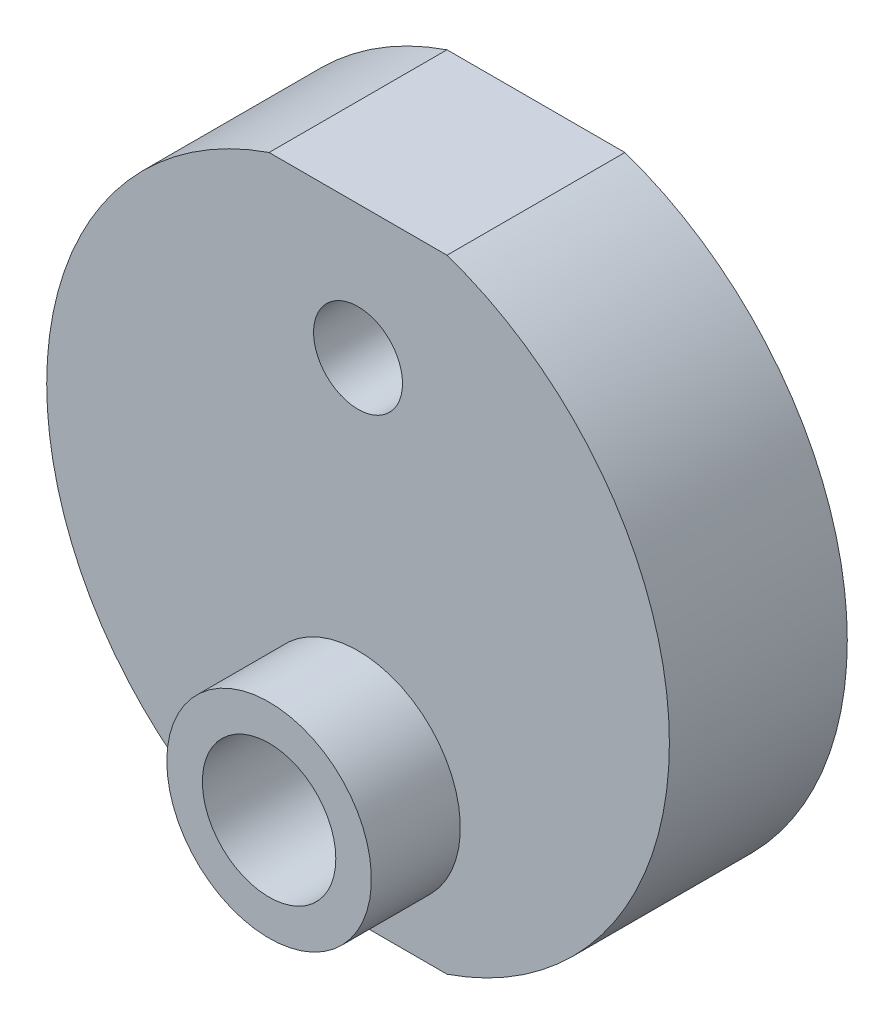
ISO-10303-21;
HEADER;
FILE_DESCRIPTION(('STEP AP214'),'2;1');
FILE_NAME('part.step','',(''),(''),'','','');
FILE_SCHEMA(('AUTOMOTIVE_DESIGN { 1 0 10303 214 1 1 1 1 }'));
ENDSEC;
DATA;
#1=APPLICATION_CONTEXT('core data for automotive mechanical design processes');
#2=APPLICATION_PROTOCOL_DEFINITION('international standard','automotive_design',2000,#1);
#3=PRODUCT_CONTEXT('',#1,'mechanical');
#4=PRODUCT('Part','Part','',(#3));
#5=PRODUCT_RELATED_PRODUCT_CATEGORY('part','',(#4));
#6=PRODUCT_DEFINITION_FORMATION('','',#4);
#7=PRODUCT_DEFINITION_CONTEXT('part definition',#1,'design');
#8=PRODUCT_DEFINITION('design','',#6,#7);
#9=PRODUCT_DEFINITION_SHAPE('','',#8);
#10=(LENGTH_UNIT() NAMED_UNIT(*) SI_UNIT(.MILLI.,.METRE.));
#11=(NAMED_UNIT(*) PLANE_ANGLE_UNIT() SI_UNIT($,.RADIAN.));
#12=(NAMED_UNIT(*) SI_UNIT($,.STERADIAN.) SOLID_ANGLE_UNIT());
#13=UNCERTAINTY_MEASURE_WITH_UNIT(LENGTH_MEASURE(1.E-05),#10,'distance_accuracy_value','');
#14=(GEOMETRIC_REPRESENTATION_CONTEXT(3) GLOBAL_UNCERTAINTY_ASSIGNED_CONTEXT((#13)) GLOBAL_UNIT_ASSIGNED_CONTEXT((#10,
#11,#12)) REPRESENTATION_CONTEXT('',''));
#15=CARTESIAN_POINT('',(0.,0.,0.));
#16=DIRECTION('',(0.,0.,1.));
#17=DIRECTION('',(1.,0.,0.));
#18=AXIS2_PLACEMENT_3D('',#15,#16,#17);
#19=CARTESIAN_POINT('',(0.,0.,12.7));
#20=DIRECTION('',(0.,0.,1.));
#21=DIRECTION('',(1.,0.,0.));
#22=AXIS2_PLACEMENT_3D('',#19,#20,#21);
#23=PLANE('',#22);
#24=DIRECTION('',(-1.,0.,0.));
#25=VECTOR('',#24,1.);
#26=CARTESIAN_POINT('',(0.,256.159,12.7));
#27=LINE('',#26,#25);
#28=CARTESIAN_POINT('',(277.621999996789,256.159,12.7));
#29=VERTEX_POINT('',#28);
#30=CARTESIAN_POINT('',(264.921999996789,256.159,12.7));
#31=VERTEX_POINT('',#30);
#32=EDGE_CURVE('E81',#29,#31,#27,.T.);
#33=ORIENTED_EDGE('',*,*,#32,.T.);
#34=CARTESIAN_POINT('',(272.541999967478,233.934,12.7));
#35=DIRECTION('',(0.,0.,1.));
#36=DIRECTION('',(1.,0.,0.));
#37=AXIS2_PLACEMENT_3D('',#34,#35,#36);
#38=CIRCLE('',#37,23.494999990494);
#39=CARTESIAN_POINT('',(264.921999996789,211.709,12.7));
#40=VERTEX_POINT('',#39);
#41=EDGE_CURVE('E76',#31,#40,#38,.T.);
#42=ORIENTED_EDGE('',*,*,#41,.T.);
#43=DIRECTION('',(-1.,0.,0.));
#44=VECTOR('',#43,1.);
#45=CARTESIAN_POINT('',(0.,211.709,12.7));
#46=LINE('',#45,#44);
#47=CARTESIAN_POINT('',(277.621999996789,211.709,12.7));
#48=VERTEX_POINT('',#47);
#49=EDGE_CURVE('E79',#48,#40,#46,.T.);
#50=ORIENTED_EDGE('',*,*,#49,.F.);
#51=CARTESIAN_POINT('',(270.002000026099,233.934,12.7));
#52=DIRECTION('',(0.,0.,1.));
#53=DIRECTION('',(1.,0.,0.));
#54=AXIS2_PLACEMENT_3D('',#51,#52,#53);
#55=CIRCLE('',#54,23.494999990494);
#56=EDGE_CURVE('E50',#48,#29,#55,.T.);
#57=ORIENTED_EDGE('',*,*,#56,.T.);
#58=EDGE_LOOP('',(#33,#42,#50,#57));
#59=FACE_BOUND('',#58,.T.);
#60=CARTESIAN_POINT('',(271.271999996789,246.634,12.7));
#61=DIRECTION('',(0.,0.,1.));
#62=DIRECTION('',(1.,0.,0.));
#63=AXIS2_PLACEMENT_3D('',#60,#61,#62);
#64=CIRCLE('',#63,3.17499999999998);
#65=CARTESIAN_POINT('',(274.446999996789,246.634,12.7));
#66=VERTEX_POINT('',#65);
#67=EDGE_CURVE('E110',#66,#66,#64,.T.);
#68=ORIENTED_EDGE('',*,*,#67,.F.);
#69=EDGE_LOOP('',(#68));
#70=FACE_BOUND('',#69,.T.);
#71=CARTESIAN_POINT('',(271.271999996789,221.234,12.7));
#72=DIRECTION('',(0.,0.,1.));
#73=DIRECTION('',(1.,0.,0.));
#74=AXIS2_PLACEMENT_3D('',#71,#72,#73);
#75=CIRCLE('',#74,7.30249999999999);
#76=CARTESIAN_POINT('',(263.969499996789,221.234,12.7));
#77=VERTEX_POINT('',#76);
#78=EDGE_CURVE('E100',#77,#77,#75,.F.);
#79=ORIENTED_EDGE('',*,*,#78,.T.);
#80=EDGE_LOOP('',(#79));
#81=FACE_BOUND('',#80,.T.);
#82=ADVANCED_FACE('F33',(#59,#70,#81),#23,.T.);
#83=CARTESIAN_POINT('',(0.,256.159,12.7));
#84=DIRECTION('',(0.,-1.,0.));
#85=DIRECTION('',(0.,0.,-1.));
#86=AXIS2_PLACEMENT_3D('',#83,#84,#85);
#87=PLANE('',#86);
#88=DIRECTION('',(-1.,0.,0.));
#89=VECTOR('',#88,1.);
#90=CARTESIAN_POINT('',(0.,256.159,0.));
#91=LINE('',#90,#89);
#92=CARTESIAN_POINT('',(277.621999996789,256.159,0.));
#93=VERTEX_POINT('',#92);
#94=CARTESIAN_POINT('',(264.921999996789,256.159,0.));
#95=VERTEX_POINT('',#94);
#96=EDGE_CURVE('E99',#93,#95,#91,.T.);
#97=ORIENTED_EDGE('',*,*,#96,.T.);
#98=DIRECTION('',(0.,0.,-1.));
#99=VECTOR('',#98,1.);
#100=CARTESIAN_POINT('',(264.921999996789,256.159,12.7));
#101=LINE('',#100,#99);
#102=EDGE_CURVE('E11',#31,#95,#101,.T.);
#103=ORIENTED_EDGE('',*,*,#102,.F.);
#104=ORIENTED_EDGE('',*,*,#32,.F.);
#105=DIRECTION('',(0.,0.,-1.));
#106=VECTOR('',#105,1.);
#107=CARTESIAN_POINT('',(277.621999996789,256.159,12.7));
#108=LINE('',#107,#106);
#109=EDGE_CURVE('E92',#29,#93,#108,.T.);
#110=ORIENTED_EDGE('',*,*,#109,.T.);
#111=EDGE_LOOP('',(#97,#103,#104,#110));
#112=FACE_BOUND('',#111,.T.);
#113=ADVANCED_FACE('F114',(#112),#87,.F.);
#114=CARTESIAN_POINT('',(272.541999967478,233.934,12.7));
#115=DIRECTION('',(0.,0.,-1.));
#116=DIRECTION('',(-1.,0.,0.));
#117=AXIS2_PLACEMENT_3D('',#114,#115,#116);
#118=CYLINDRICAL_SURFACE('',#117,23.494999990494);
#119=CARTESIAN_POINT('',(272.541999967478,233.934,0.));
#120=DIRECTION('',(0.,0.,1.));
#121=DIRECTION('',(1.,0.,0.));
#122=AXIS2_PLACEMENT_3D('',#119,#120,#121);
#123=CIRCLE('',#122,23.494999990494);
#124=CARTESIAN_POINT('',(264.921999996789,211.709,0.));
#125=VERTEX_POINT('',#124);
#126=EDGE_CURVE('E86',#95,#125,#123,.T.);
#127=ORIENTED_EDGE('',*,*,#126,.T.);
#128=DIRECTION('',(0.,0.,-1.));
#129=VECTOR('',#128,1.);
#130=CARTESIAN_POINT('',(264.921999996789,211.709,12.7));
#131=LINE('',#130,#129);
#132=EDGE_CURVE('E42',#40,#125,#131,.T.);
#133=ORIENTED_EDGE('',*,*,#132,.F.);
#134=ORIENTED_EDGE('',*,*,#41,.F.);
#135=ORIENTED_EDGE('',*,*,#102,.T.);
#136=EDGE_LOOP('',(#127,#133,#134,#135));
#137=FACE_BOUND('',#136,.T.);
#138=ADVANCED_FACE('F85',(#137),#118,.T.);
#139=CARTESIAN_POINT('',(0.,211.709,12.7));
#140=DIRECTION('',(0.,-1.,0.));
#141=DIRECTION('',(0.,0.,-1.));
#142=AXIS2_PLACEMENT_3D('',#139,#140,#141);
#143=PLANE('',#142);
#144=DIRECTION('',(-1.,0.,0.));
#145=VECTOR('',#144,1.);
#146=CARTESIAN_POINT('',(0.,211.709,0.));
#147=LINE('',#146,#145);
#148=CARTESIAN_POINT('',(277.621999996789,211.709,0.));
#149=VERTEX_POINT('',#148);
#150=EDGE_CURVE('E104',#149,#125,#147,.T.);
#151=ORIENTED_EDGE('',*,*,#150,.F.);
#152=DIRECTION('',(0.,0.,-1.));
#153=VECTOR('',#152,1.);
#154=CARTESIAN_POINT('',(277.621999996789,211.709,12.7));
#155=LINE('',#154,#153);
#156=EDGE_CURVE('E66',#48,#149,#155,.T.);
#157=ORIENTED_EDGE('',*,*,#156,.F.);
#158=ORIENTED_EDGE('',*,*,#49,.T.);
#159=ORIENTED_EDGE('',*,*,#132,.T.);
#160=EDGE_LOOP('',(#151,#157,#158,#159));
#161=FACE_BOUND('',#160,.T.);
#162=ADVANCED_FACE('F90',(#161),#143,.T.);
#163=CARTESIAN_POINT('',(270.002000026099,233.934,12.7));
#164=DIRECTION('',(0.,0.,-1.));
#165=DIRECTION('',(-1.,0.,0.));
#166=AXIS2_PLACEMENT_3D('',#163,#164,#165);
#167=CYLINDRICAL_SURFACE('',#166,23.494999990494);
#168=CARTESIAN_POINT('',(270.002000026099,233.934,0.));
#169=DIRECTION('',(0.,0.,1.));
#170=DIRECTION('',(1.,0.,0.));
#171=AXIS2_PLACEMENT_3D('',#168,#169,#170);
#172=CIRCLE('',#171,23.494999990494);
#173=EDGE_CURVE('E69',#149,#93,#172,.T.);
#174=ORIENTED_EDGE('',*,*,#173,.T.);
#175=ORIENTED_EDGE('',*,*,#109,.F.);
#176=ORIENTED_EDGE('',*,*,#56,.F.);
#177=ORIENTED_EDGE('',*,*,#156,.T.);
#178=EDGE_LOOP('',(#174,#175,#176,#177));
#179=FACE_BOUND('',#178,.T.);
#180=ADVANCED_FACE('F126',(#179),#167,.T.);
#181=CARTESIAN_POINT('',(271.271999996789,246.634,12.7));
#182=DIRECTION('',(0.,0.,-1.));
#183=DIRECTION('',(-1.,0.,0.));
#184=AXIS2_PLACEMENT_3D('',#181,#182,#183);
#185=CYLINDRICAL_SURFACE('',#184,3.17499999999998);
#186=ORIENTED_EDGE('',*,*,#67,.T.);
#187=EDGE_LOOP('',(#186));
#188=FACE_BOUND('',#187,.T.);
#189=CARTESIAN_POINT('',(271.271999996789,246.634,0.));
#190=DIRECTION('',(0.,0.,1.));
#191=DIRECTION('',(1.,0.,0.));
#192=AXIS2_PLACEMENT_3D('',#189,#190,#191);
#193=CIRCLE('',#192,3.17499999999998);
#194=CARTESIAN_POINT('',(274.446999996789,246.634,0.));
#195=VERTEX_POINT('',#194);
#196=EDGE_CURVE('E96',#195,#195,#193,.T.);
#197=ORIENTED_EDGE('',*,*,#196,.F.);
#198=EDGE_LOOP('',(#197));
#199=FACE_BOUND('',#198,.T.);
#200=ADVANCED_FACE('F35',(#188,#199),#185,.F.);
#201=CARTESIAN_POINT('',(271.271999996789,221.234,12.7));
#202=DIRECTION('',(0.,0.,-1.));
#203=DIRECTION('',(-1.,0.,0.));
#204=AXIS2_PLACEMENT_3D('',#201,#202,#203);
#205=CYLINDRICAL_SURFACE('',#204,4.76250000000006);
#206=CARTESIAN_POINT('',(271.271999996789,221.234,0.));
#207=DIRECTION('',(0.,0.,1.));
#208=DIRECTION('',(1.,0.,0.));
#209=AXIS2_PLACEMENT_3D('',#206,#207,#208);
#210=CIRCLE('',#209,4.76250000000006);
#211=CARTESIAN_POINT('',(276.034499996789,221.234,0.));
#212=VERTEX_POINT('',#211);
#213=EDGE_CURVE('E107',#212,#212,#210,.T.);
#214=ORIENTED_EDGE('',*,*,#213,.F.);
#215=EDGE_LOOP('',(#214));
#216=FACE_BOUND('',#215,.T.);
#217=CARTESIAN_POINT('',(271.271999996789,221.234,19.05));
#218=DIRECTION('',(0.,0.,1.));
#219=DIRECTION('',(1.,0.,0.));
#220=AXIS2_PLACEMENT_3D('',#217,#218,#219);
#221=CIRCLE('',#220,4.76250000000006);
#222=CARTESIAN_POINT('',(276.034499996789,221.234,19.05));
#223=VERTEX_POINT('',#222);
#224=EDGE_CURVE('E206',#223,#223,#221,.T.);
#225=ORIENTED_EDGE('',*,*,#224,.T.);
#226=EDGE_LOOP('',(#225));
#227=FACE_BOUND('',#226,.T.);
#228=ADVANCED_FACE('F120',(#216,#227),#205,.F.);
#229=CARTESIAN_POINT('',(0.,0.,0.));
#230=DIRECTION('',(0.,0.,1.));
#231=DIRECTION('',(1.,0.,0.));
#232=AXIS2_PLACEMENT_3D('',#229,#230,#231);
#233=PLANE('',#232);
#234=ORIENTED_EDGE('',*,*,#213,.T.);
#235=EDGE_LOOP('',(#234));
#236=FACE_BOUND('',#235,.T.);
#237=ORIENTED_EDGE('',*,*,#96,.F.);
#238=ORIENTED_EDGE('',*,*,#173,.F.);
#239=ORIENTED_EDGE('',*,*,#150,.T.);
#240=ORIENTED_EDGE('',*,*,#126,.F.);
#241=EDGE_LOOP('',(#237,#238,#239,#240));
#242=FACE_BOUND('',#241,.T.);
#243=ORIENTED_EDGE('',*,*,#196,.T.);
#244=EDGE_LOOP('',(#243));
#245=FACE_BOUND('',#244,.T.);
#246=ADVANCED_FACE('F116',(#236,#242,#245),#233,.F.);
#247=CARTESIAN_POINT('',(271.271999996789,221.234,19.05));
#248=DIRECTION('',(0.,0.,-1.));
#249=DIRECTION('',(-1.,0.,0.));
#250=AXIS2_PLACEMENT_3D('',#247,#248,#249);
#251=CYLINDRICAL_SURFACE('',#250,7.30249999999999);
#252=CARTESIAN_POINT('',(271.271999996789,221.234,19.05));
#253=DIRECTION('',(0.,0.,1.));
#254=DIRECTION('',(1.,0.,0.));
#255=AXIS2_PLACEMENT_3D('',#252,#253,#254);
#256=CIRCLE('',#255,7.30249999999999);
#257=CARTESIAN_POINT('',(263.969499996789,221.234,19.05));
#258=VERTEX_POINT('',#257);
#259=EDGE_CURVE('E209',#258,#258,#256,.T.);
#260=CARTESIAN_POINT('',(263.969499996789,221.234,12.7));
#261=CARTESIAN_POINT('',(263.969499996789,221.234,12.7661458333333));
#262=CARTESIAN_POINT('',(263.969499996789,221.234,12.8322916666667));
#263=CARTESIAN_POINT('',(263.969499996789,221.234,12.9645833333333));
#264=CARTESIAN_POINT('',(263.969499996789,221.234,13.0307291666667));
#265=CARTESIAN_POINT('',(263.969499996789,221.234,13.1630208333333));
#266=CARTESIAN_POINT('',(263.969499996789,221.234,13.2291666666667));
#267=CARTESIAN_POINT('',(263.969499996789,221.234,13.3614583333333));
#268=CARTESIAN_POINT('',(263.969499996789,221.234,13.4276041666667));
#269=CARTESIAN_POINT('',(263.969499996789,221.234,13.5598958333333));
#270=CARTESIAN_POINT('',(263.969499996789,221.234,13.6260416666667));
#271=CARTESIAN_POINT('',(263.969499996789,221.234,13.7583333333333));
#272=CARTESIAN_POINT('',(263.969499996789,221.234,13.8244791666667));
#273=CARTESIAN_POINT('',(263.969499996789,221.234,13.9567708333333));
#274=CARTESIAN_POINT('',(263.969499996789,221.234,14.0229166666667));
#275=CARTESIAN_POINT('',(263.969499996789,221.234,14.1552083333333));
#276=CARTESIAN_POINT('',(263.969499996789,221.234,14.2213541666667));
#277=CARTESIAN_POINT('',(263.969499996789,221.234,14.3536458333333));
#278=CARTESIAN_POINT('',(263.969499996789,221.234,14.4197916666667));
#279=CARTESIAN_POINT('',(263.969499996789,221.234,14.5520833333333));
#280=CARTESIAN_POINT('',(263.969499996789,221.234,14.6182291666667));
#281=CARTESIAN_POINT('',(263.969499996789,221.234,14.7505208333333));
#282=CARTESIAN_POINT('',(263.969499996789,221.234,14.8166666666667));
#283=CARTESIAN_POINT('',(263.969499996789,221.234,14.9489583333333));
#284=CARTESIAN_POINT('',(263.969499996789,221.234,15.0151041666667));
#285=CARTESIAN_POINT('',(263.969499996789,221.234,15.1473958333333));
#286=CARTESIAN_POINT('',(263.969499996789,221.234,15.2135416666667));
#287=CARTESIAN_POINT('',(263.969499996789,221.234,15.3458333333333));
#288=CARTESIAN_POINT('',(263.969499996789,221.234,15.4119791666667));
#289=CARTESIAN_POINT('',(263.969499996789,221.234,15.5442708333333));
#290=CARTESIAN_POINT('',(263.969499996789,221.234,15.6104166666667));
#291=CARTESIAN_POINT('',(263.969499996789,221.234,15.7427083333333));
#292=CARTESIAN_POINT('',(263.969499996789,221.234,15.8088541666667));
#293=CARTESIAN_POINT('',(263.969499996789,221.234,15.9411458333333));
#294=CARTESIAN_POINT('',(263.969499996789,221.234,16.0072916666667));
#295=CARTESIAN_POINT('',(263.969499996789,221.234,16.1395833333333));
#296=CARTESIAN_POINT('',(263.969499996789,221.234,16.2057291666667));
#297=CARTESIAN_POINT('',(263.969499996789,221.234,16.3380208333333));
#298=CARTESIAN_POINT('',(263.969499996789,221.234,16.4041666666667));
#299=CARTESIAN_POINT('',(263.969499996789,221.234,16.5364583333333));
#300=CARTESIAN_POINT('',(263.969499996789,221.234,16.6026041666667));
#301=CARTESIAN_POINT('',(263.969499996789,221.234,16.7348958333333));
#302=CARTESIAN_POINT('',(263.969499996789,221.234,16.8010416666667));
#303=CARTESIAN_POINT('',(263.969499996789,221.234,16.9333333333333));
#304=CARTESIAN_POINT('',(263.969499996789,221.234,16.9994791666667));
#305=CARTESIAN_POINT('',(263.969499996789,221.234,17.1317708333333));
#306=CARTESIAN_POINT('',(263.969499996789,221.234,17.1979166666667));
#307=CARTESIAN_POINT('',(263.969499996789,221.234,17.3302083333333));
#308=CARTESIAN_POINT('',(263.969499996789,221.234,17.3963541666667));
#309=CARTESIAN_POINT('',(263.969499996789,221.234,17.5286458333333));
#310=CARTESIAN_POINT('',(263.969499996789,221.234,17.5947916666667));
#311=CARTESIAN_POINT('',(263.969499996789,221.234,17.7270833333333));
#312=CARTESIAN_POINT('',(263.969499996789,221.234,17.7932291666667));
#313=CARTESIAN_POINT('',(263.969499996789,221.234,17.9255208333333));
#314=CARTESIAN_POINT('',(263.969499996789,221.234,17.9916666666667));
#315=CARTESIAN_POINT('',(263.969499996789,221.234,18.1239583333333));
#316=CARTESIAN_POINT('',(263.969499996789,221.234,18.1901041666667));
#317=CARTESIAN_POINT('',(263.969499996789,221.234,18.3223958333333));
#318=CARTESIAN_POINT('',(263.969499996789,221.234,18.3885416666667));
#319=CARTESIAN_POINT('',(263.969499996789,221.234,18.5208333333333));
#320=CARTESIAN_POINT('',(263.969499996789,221.234,18.5869791666667));
#321=CARTESIAN_POINT('',(263.969499996789,221.234,18.7192708333333));
#322=CARTESIAN_POINT('',(263.969499996789,221.234,18.7854166666667));
#323=CARTESIAN_POINT('',(263.969499996789,221.234,18.9177083333333));
#324=CARTESIAN_POINT('',(263.969499996789,221.234,18.9838541666667));
#325=CARTESIAN_POINT('',(263.969499996789,221.234,19.05));
#326=B_SPLINE_CURVE_WITH_KNOTS('',3,(#260,#261,#262,#263,#264,#265,#266,#267,#268,#269,#270,
#271,#272,#273,#274,#275,#276,#277,#278,#279,#280,#281,#282,#283,#284,#285,#286,#287,#288,#289,
#290,#291,#292,#293,#294,#295,#296,#297,#298,#299,#300,#301,#302,#303,#304,#305,#306,#307,#308,
#309,#310,#311,#312,#313,#314,#315,#316,#317,#318,#319,#320,#321,#322,#323,#324,#325),
.UNSPECIFIED.,.F.,.F.,(4,2,2,2,2,2,2,2,2,2,2,2,2,2,2,2,2,2,2,2,2,2,2,2,2,2,2,2,2,2,2,2,4),(0.,
0.198437499999999,0.396874999999998,0.5953125,0.793749999999999,0.992187499999998,1.190625,
1.3890625,1.5875,1.7859375,1.984375,2.1828125,2.38125,2.5796875,2.778125,2.9765625,3.175,
3.3734375,3.571875,3.7703125,3.96875,4.1671875,4.365625,4.5640625,4.7625,4.9609375,5.159375,
5.3578125,5.55625,5.7546875,5.953125,6.1515625,6.35),.UNSPECIFIED.);
#327=EDGE_CURVE('BSEAM119',#77,#258,#326,.T.);
#328=ORIENTED_EDGE('',*,*,#78,.F.);
#329=ORIENTED_EDGE('',*,*,#259,.F.);
#330=ORIENTED_EDGE('',*,*,#327,.T.);
#331=ORIENTED_EDGE('',*,*,#327,.F.);
#332=EDGE_LOOP('',(#328,#330,#329,#331));
#333=FACE_BOUND('',#332,.T.);
#334=ADVANCED_FACE('F119',(#333),#251,.T.);
#335=CARTESIAN_POINT('',(0.,0.,19.05));
#336=DIRECTION('',(0.,0.,1.));
#337=DIRECTION('',(1.,0.,0.));
#338=AXIS2_PLACEMENT_3D('',#335,#336,#337);
#339=PLANE('',#338);
#340=ORIENTED_EDGE('',*,*,#224,.F.);
#341=EDGE_LOOP('',(#340));
#342=FACE_BOUND('',#341,.T.);
#343=ORIENTED_EDGE('',*,*,#259,.T.);
#344=EDGE_LOOP('',(#343));
#345=FACE_BOUND('',#344,.T.);
#346=ADVANCED_FACE('F191',(#342,#345),#339,.T.);
#347=CLOSED_SHELL('',(#82,#113,#138,#162,#180,#200,#228,#246,#334,#346));
#348=MANIFOLD_SOLID_BREP('B2',#347);
#349=ADVANCED_BREP_SHAPE_REPRESENTATION('',(#18,#348),#14);
#350=SHAPE_DEFINITION_REPRESENTATION(#9,#349);
ENDSEC;
END-ISO-10303-21;
